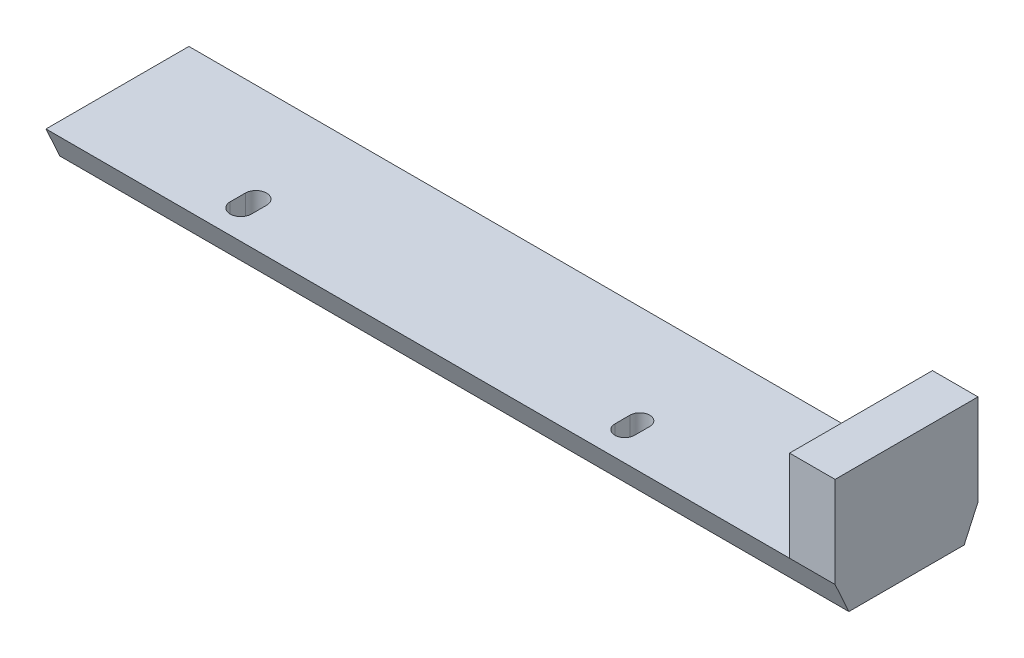
ISO-10303-21;
HEADER;
FILE_DESCRIPTION(('STEP AP214'),'2;1');
FILE_NAME('part.step','',(''),(''),'','','');
FILE_SCHEMA(('AUTOMOTIVE_DESIGN { 1 0 10303 214 1 1 1 1 }'));
ENDSEC;
DATA;
#1=APPLICATION_CONTEXT('core data for automotive mechanical design processes');
#2=APPLICATION_PROTOCOL_DEFINITION('international standard','automotive_design',2000,#1);
#3=PRODUCT_CONTEXT('',#1,'mechanical');
#4=PRODUCT('Part','Part','',(#3));
#5=PRODUCT_RELATED_PRODUCT_CATEGORY('part','',(#4));
#6=PRODUCT_DEFINITION_FORMATION('','',#4);
#7=PRODUCT_DEFINITION_CONTEXT('part definition',#1,'design');
#8=PRODUCT_DEFINITION('design','',#6,#7);
#9=PRODUCT_DEFINITION_SHAPE('','',#8);
#10=(LENGTH_UNIT() NAMED_UNIT(*) SI_UNIT(.MILLI.,.METRE.));
#11=(NAMED_UNIT(*) PLANE_ANGLE_UNIT() SI_UNIT($,.RADIAN.));
#12=(NAMED_UNIT(*) SI_UNIT($,.STERADIAN.) SOLID_ANGLE_UNIT());
#13=UNCERTAINTY_MEASURE_WITH_UNIT(LENGTH_MEASURE(1.E-05),#10,'distance_accuracy_value','');
#14=(GEOMETRIC_REPRESENTATION_CONTEXT(3) GLOBAL_UNCERTAINTY_ASSIGNED_CONTEXT((#13)) GLOBAL_UNIT_ASSIGNED_CONTEXT((#10,
#11,#12)) REPRESENTATION_CONTEXT('',''));
#15=CARTESIAN_POINT('',(0.,0.,0.));
#16=DIRECTION('',(0.,0.,1.));
#17=DIRECTION('',(1.,0.,0.));
#18=AXIS2_PLACEMENT_3D('',#15,#16,#17);
#19=CARTESIAN_POINT('',(0.,2.,0.));
#20=DIRECTION('',(0.,-1.,0.));
#21=DIRECTION('',(0.,0.,1.));
#22=AXIS2_PLACEMENT_3D('',#19,#20,#21);
#23=PLANE('',#22);
#24=DIRECTION('',(0.,0.,-1.));
#25=VECTOR('',#24,1.);
#26=CARTESIAN_POINT('',(10.2263631920337,2.,-2.20000000000115));
#27=LINE('',#26,#25);
#28=CARTESIAN_POINT('',(10.2263631920337,2.,-2.20000000000115));
#29=VERTEX_POINT('',#28);
#30=CARTESIAN_POINT('',(10.2263631920337,2.,-3.20000000000115));
#31=VERTEX_POINT('',#30);
#32=EDGE_CURVE('E239',#29,#31,#27,.T.);
#33=ORIENTED_EDGE('',*,*,#32,.T.);
#34=CARTESIAN_POINT('',(10.9263631920337,2.,-3.20000000000115));
#35=DIRECTION('',(0.,-1.,0.));
#36=DIRECTION('',(0.,0.,-1.));
#37=AXIS2_PLACEMENT_3D('',#34,#35,#36);
#38=CIRCLE('',#37,0.699999999999999);
#39=CARTESIAN_POINT('',(11.6263631920337,2.,-3.20000000000115));
#40=VERTEX_POINT('',#39);
#41=EDGE_CURVE('E236',#31,#40,#38,.T.);
#42=ORIENTED_EDGE('',*,*,#41,.T.);
#43=DIRECTION('',(0.,0.,1.));
#44=VECTOR('',#43,1.);
#45=CARTESIAN_POINT('',(11.6263631920337,2.,-2.20000000000115));
#46=LINE('',#45,#44);
#47=CARTESIAN_POINT('',(11.6263631920337,2.,-2.20000000000115));
#48=VERTEX_POINT('',#47);
#49=EDGE_CURVE('E232',#40,#48,#46,.T.);
#50=ORIENTED_EDGE('',*,*,#49,.T.);
#51=CARTESIAN_POINT('',(10.9263631920337,2.,-2.20000000000115));
#52=DIRECTION('',(0.,-1.,0.));
#53=DIRECTION('',(0.,0.,-1.));
#54=AXIS2_PLACEMENT_3D('',#51,#52,#53);
#55=CIRCLE('',#54,0.699999999999999);
#56=EDGE_CURVE('E206',#48,#29,#55,.T.);
#57=ORIENTED_EDGE('',*,*,#56,.T.);
#58=EDGE_LOOP('',(#33,#42,#50,#57));
#59=FACE_BOUND('',#58,.T.);
#60=DIRECTION('',(0.,0.,-1.));
#61=VECTOR('',#60,1.);
#62=CARTESIAN_POINT('',(35.5763631920337,2.,-2.20000000000115));
#63=LINE('',#62,#61);
#64=CARTESIAN_POINT('',(35.5763631920337,2.,-2.20000000000115));
#65=VERTEX_POINT('',#64);
#66=CARTESIAN_POINT('',(35.5763631920337,2.,-3.20000000000115));
#67=VERTEX_POINT('',#66);
#68=EDGE_CURVE('E207',#65,#67,#63,.T.);
#69=ORIENTED_EDGE('',*,*,#68,.T.);
#70=CARTESIAN_POINT('',(36.2263631920337,2.,-3.20000000000115));
#71=DIRECTION('',(0.,-1.,0.));
#72=DIRECTION('',(0.,0.,-1.));
#73=AXIS2_PLACEMENT_3D('',#70,#71,#72);
#74=CIRCLE('',#73,0.650000000000005);
#75=CARTESIAN_POINT('',(36.8763631920338,2.,-3.20000000000115));
#76=VERTEX_POINT('',#75);
#77=EDGE_CURVE('E210',#67,#76,#74,.T.);
#78=ORIENTED_EDGE('',*,*,#77,.T.);
#79=DIRECTION('',(0.,0.,1.));
#80=VECTOR('',#79,1.);
#81=CARTESIAN_POINT('',(36.8763631920338,2.,-2.20000000000115));
#82=LINE('',#81,#80);
#83=CARTESIAN_POINT('',(36.8763631920338,2.,-2.20000000000115));
#84=VERTEX_POINT('',#83);
#85=EDGE_CURVE('E192',#76,#84,#82,.T.);
#86=ORIENTED_EDGE('',*,*,#85,.T.);
#87=CARTESIAN_POINT('',(36.2263631920337,2.,-2.20000000000115));
#88=DIRECTION('',(0.,-1.,0.));
#89=DIRECTION('',(0.,0.,-1.));
#90=AXIS2_PLACEMENT_3D('',#87,#88,#89);
#91=CIRCLE('',#90,0.650000000000005);
#92=EDGE_CURVE('E203',#84,#65,#91,.T.);
#93=ORIENTED_EDGE('',*,*,#92,.T.);
#94=EDGE_LOOP('',(#69,#78,#86,#93));
#95=FACE_BOUND('',#94,.T.);
#96=DIRECTION('',(0.,0.,-1.));
#97=VECTOR('',#96,1.);
#98=CARTESIAN_POINT('',(49.,2.,0.));
#99=LINE('',#98,#97);
#100=CARTESIAN_POINT('',(49.,2.,-0.290909090909087));
#101=VERTEX_POINT('',#100);
#102=CARTESIAN_POINT('',(49.,2.,-9.70909090909091));
#103=VERTEX_POINT('',#102);
#104=EDGE_CURVE('E174',#101,#103,#99,.T.);
#105=ORIENTED_EDGE('',*,*,#104,.T.);
#106=DIRECTION('',(1.,0.,0.));
#107=VECTOR('',#106,1.);
#108=CARTESIAN_POINT('',(0.,2.,-9.70909090909091));
#109=LINE('',#108,#107);
#110=CARTESIAN_POINT('',(0.,2.,-9.70909090909091));
#111=VERTEX_POINT('',#110);
#112=EDGE_CURVE('E168',#111,#103,#109,.T.);
#113=ORIENTED_EDGE('',*,*,#112,.F.);
#114=DIRECTION('',(0.,0.,-1.));
#115=VECTOR('',#114,1.);
#116=CARTESIAN_POINT('',(0.,2.,-10.));
#117=LINE('',#116,#115);
#118=CARTESIAN_POINT('',(0.,2.,-0.290909090909087));
#119=VERTEX_POINT('',#118);
#120=EDGE_CURVE('E150',#119,#111,#117,.T.);
#121=ORIENTED_EDGE('',*,*,#120,.F.);
#122=DIRECTION('',(1.,0.,0.));
#123=VECTOR('',#122,1.);
#124=CARTESIAN_POINT('',(0.,2.,-0.290909090909087));
#125=LINE('',#124,#123);
#126=EDGE_CURVE('E159',#119,#101,#125,.T.);
#127=ORIENTED_EDGE('',*,*,#126,.T.);
#128=EDGE_LOOP('',(#105,#113,#121,#127));
#129=FACE_BOUND('',#128,.T.);
#130=ADVANCED_FACE('F38',(#59,#95,#129),#23,.F.);
#131=CARTESIAN_POINT('',(52.,2.,-10.));
#132=DIRECTION('',(-1.,0.,0.));
#133=DIRECTION('',(0.,0.,-1.));
#134=AXIS2_PLACEMENT_3D('',#131,#132,#133);
#135=PLANE('',#134);
#136=DIRECTION('',(0.,-0.910366477462604,-0.413802944301185));
#137=VECTOR('',#136,1.);
#138=CARTESIAN_POINT('',(52.,2.,-0.290909090909087));
#139=LINE('',#138,#137);
#140=CARTESIAN_POINT('',(52.,2.,-0.290909090909087));
#141=VERTEX_POINT('',#140);
#142=CARTESIAN_POINT('',(52.,0.,-1.2));
#143=VERTEX_POINT('',#142);
#144=EDGE_CURVE('E156',#141,#143,#139,.T.);
#145=ORIENTED_EDGE('',*,*,#144,.T.);
#146=DIRECTION('',(0.,0.,1.));
#147=VECTOR('',#146,1.);
#148=CARTESIAN_POINT('',(52.,0.,-10.));
#149=LINE('',#148,#147);
#150=CARTESIAN_POINT('',(52.,0.,-8.8));
#151=VERTEX_POINT('',#150);
#152=EDGE_CURVE('E170',#151,#143,#149,.T.);
#153=ORIENTED_EDGE('',*,*,#152,.F.);
#154=DIRECTION('',(0.,0.910366477462604,-0.413802944301186));
#155=VECTOR('',#154,1.);
#156=CARTESIAN_POINT('',(52.,2.,-9.70909090909091));
#157=LINE('',#156,#155);
#158=CARTESIAN_POINT('',(52.,2.,-9.70909090909091));
#159=VERTEX_POINT('',#158);
#160=EDGE_CURVE('E259',#151,#159,#157,.T.);
#161=ORIENTED_EDGE('',*,*,#160,.T.);
#162=DIRECTION('',(0.,1.,0.));
#163=VECTOR('',#162,1.);
#164=CARTESIAN_POINT('',(52.,8.,-9.70909090909091));
#165=LINE('',#164,#163);
#166=CARTESIAN_POINT('',(52.,8.,-9.70909090909091));
#167=VERTEX_POINT('',#166);
#168=EDGE_CURVE('E261',#159,#167,#165,.T.);
#169=ORIENTED_EDGE('',*,*,#168,.T.);
#170=DIRECTION('',(0.,0.,1.));
#171=VECTOR('',#170,1.);
#172=CARTESIAN_POINT('',(52.,8.,0.));
#173=LINE('',#172,#171);
#174=CARTESIAN_POINT('',(52.,8.,-0.290909090909087));
#175=VERTEX_POINT('',#174);
#176=EDGE_CURVE('E182',#167,#175,#173,.T.);
#177=ORIENTED_EDGE('',*,*,#176,.T.);
#178=DIRECTION('',(0.,-1.,0.));
#179=VECTOR('',#178,1.);
#180=CARTESIAN_POINT('',(52.,2.,-0.290909090909087));
#181=LINE('',#180,#179);
#182=EDGE_CURVE('E264',#175,#141,#181,.T.);
#183=ORIENTED_EDGE('',*,*,#182,.T.);
#184=EDGE_LOOP('',(#145,#153,#161,#169,#177,#183));
#185=FACE_BOUND('',#184,.T.);
#186=ADVANCED_FACE('F40',(#185),#135,.F.);
#187=CARTESIAN_POINT('',(0.,2.,-10.));
#188=DIRECTION('',(1.,0.,0.));
#189=DIRECTION('',(0.,0.,1.));
#190=AXIS2_PLACEMENT_3D('',#187,#188,#189);
#191=PLANE('',#190);
#192=ORIENTED_EDGE('',*,*,#120,.T.);
#193=DIRECTION('',(0.,0.910366477462604,-0.413802944301186));
#194=VECTOR('',#193,1.);
#195=CARTESIAN_POINT('',(0.,2.,-9.70909090909091));
#196=LINE('',#195,#194);
#197=CARTESIAN_POINT('',(0.,0.,-8.8));
#198=VERTEX_POINT('',#197);
#199=EDGE_CURVE('E257',#198,#111,#196,.T.);
#200=ORIENTED_EDGE('',*,*,#199,.F.);
#201=DIRECTION('',(0.,0.,-1.));
#202=VECTOR('',#201,1.);
#203=CARTESIAN_POINT('',(0.,0.,-10.));
#204=LINE('',#203,#202);
#205=CARTESIAN_POINT('',(0.,0.,-1.2));
#206=VERTEX_POINT('',#205);
#207=EDGE_CURVE('E153',#206,#198,#204,.T.);
#208=ORIENTED_EDGE('',*,*,#207,.F.);
#209=DIRECTION('',(0.,-0.910366477462604,-0.413802944301185));
#210=VECTOR('',#209,1.);
#211=CARTESIAN_POINT('',(0.,2.,-0.290909090909087));
#212=LINE('',#211,#210);
#213=EDGE_CURVE('E145',#119,#206,#212,.T.);
#214=ORIENTED_EDGE('',*,*,#213,.F.);
#215=EDGE_LOOP('',(#192,#200,#208,#214));
#216=FACE_BOUND('',#215,.T.);
#217=ADVANCED_FACE('F147',(#216),#191,.F.);
#218=CARTESIAN_POINT('',(0.,0.,0.));
#219=DIRECTION('',(0.,-1.,0.));
#220=DIRECTION('',(0.,0.,1.));
#221=AXIS2_PLACEMENT_3D('',#218,#219,#220);
#222=PLANE('',#221);
#223=DIRECTION('',(1.,0.,0.));
#224=VECTOR('',#223,1.);
#225=CARTESIAN_POINT('',(0.,0.,-1.2));
#226=LINE('',#225,#224);
#227=EDGE_CURVE('E165',#206,#143,#226,.T.);
#228=ORIENTED_EDGE('',*,*,#227,.F.);
#229=ORIENTED_EDGE('',*,*,#207,.T.);
#230=DIRECTION('',(1.,0.,0.));
#231=VECTOR('',#230,1.);
#232=CARTESIAN_POINT('',(0.,0.,-8.8));
#233=LINE('',#232,#231);
#234=EDGE_CURVE('E260',#198,#151,#233,.T.);
#235=ORIENTED_EDGE('',*,*,#234,.T.);
#236=ORIENTED_EDGE('',*,*,#152,.T.);
#237=EDGE_LOOP('',(#228,#229,#235,#236));
#238=FACE_BOUND('',#237,.T.);
#239=CARTESIAN_POINT('',(10.9263631920337,0.,-2.20000000000115));
#240=DIRECTION('',(0.,-1.,0.));
#241=DIRECTION('',(0.,0.,-1.));
#242=AXIS2_PLACEMENT_3D('',#239,#240,#241);
#243=CIRCLE('',#242,0.699999999999999);
#244=CARTESIAN_POINT('',(11.6263631920337,0.,-2.20000000000115));
#245=VERTEX_POINT('',#244);
#246=CARTESIAN_POINT('',(10.2263631920337,0.,-2.20000000000115));
#247=VERTEX_POINT('',#246);
#248=EDGE_CURVE('E235',#245,#247,#243,.T.);
#249=ORIENTED_EDGE('',*,*,#248,.F.);
#250=DIRECTION('',(0.,0.,1.));
#251=VECTOR('',#250,1.);
#252=CARTESIAN_POINT('',(11.6263631920337,0.,-2.20000000000115));
#253=LINE('',#252,#251);
#254=CARTESIAN_POINT('',(11.6263631920337,0.,-3.20000000000115));
#255=VERTEX_POINT('',#254);
#256=EDGE_CURVE('E226',#255,#245,#253,.T.);
#257=ORIENTED_EDGE('',*,*,#256,.F.);
#258=CARTESIAN_POINT('',(10.9263631920337,0.,-3.20000000000115));
#259=DIRECTION('',(0.,-1.,0.));
#260=DIRECTION('',(0.,0.,-1.));
#261=AXIS2_PLACEMENT_3D('',#258,#259,#260);
#262=CIRCLE('',#261,0.699999999999999);
#263=CARTESIAN_POINT('',(10.2263631920337,0.,-3.20000000000115));
#264=VERTEX_POINT('',#263);
#265=EDGE_CURVE('E246',#264,#255,#262,.T.);
#266=ORIENTED_EDGE('',*,*,#265,.F.);
#267=DIRECTION('',(0.,0.,-1.));
#268=VECTOR('',#267,1.);
#269=CARTESIAN_POINT('',(10.2263631920337,0.,-2.20000000000115));
#270=LINE('',#269,#268);
#271=EDGE_CURVE('E249',#247,#264,#270,.T.);
#272=ORIENTED_EDGE('',*,*,#271,.F.);
#273=EDGE_LOOP('',(#249,#257,#266,#272));
#274=FACE_BOUND('',#273,.T.);
#275=CARTESIAN_POINT('',(36.2263631920337,0.,-2.20000000000115));
#276=DIRECTION('',(0.,-1.,0.));
#277=DIRECTION('',(0.,0.,-1.));
#278=AXIS2_PLACEMENT_3D('',#275,#276,#277);
#279=CIRCLE('',#278,0.650000000000005);
#280=CARTESIAN_POINT('',(36.8763631920338,0.,-2.20000000000115));
#281=VERTEX_POINT('',#280);
#282=CARTESIAN_POINT('',(35.5763631920337,0.,-2.20000000000115));
#283=VERTEX_POINT('',#282);
#284=EDGE_CURVE('E189',#281,#283,#279,.T.);
#285=ORIENTED_EDGE('',*,*,#284,.F.);
#286=DIRECTION('',(0.,0.,1.));
#287=VECTOR('',#286,1.);
#288=CARTESIAN_POINT('',(36.8763631920338,0.,-2.20000000000115));
#289=LINE('',#288,#287);
#290=CARTESIAN_POINT('',(36.8763631920338,0.,-3.20000000000115));
#291=VERTEX_POINT('',#290);
#292=EDGE_CURVE('E199',#291,#281,#289,.T.);
#293=ORIENTED_EDGE('',*,*,#292,.F.);
#294=CARTESIAN_POINT('',(36.2263631920337,0.,-3.20000000000115));
#295=DIRECTION('',(0.,-1.,0.));
#296=DIRECTION('',(0.,0.,-1.));
#297=AXIS2_PLACEMENT_3D('',#294,#295,#296);
#298=CIRCLE('',#297,0.650000000000005);
#299=CARTESIAN_POINT('',(35.5763631920337,0.,-3.20000000000115));
#300=VERTEX_POINT('',#299);
#301=EDGE_CURVE('E196',#300,#291,#298,.T.);
#302=ORIENTED_EDGE('',*,*,#301,.F.);
#303=DIRECTION('',(0.,0.,-1.));
#304=VECTOR('',#303,1.);
#305=CARTESIAN_POINT('',(35.5763631920337,0.,-2.20000000000115));
#306=LINE('',#305,#304);
#307=EDGE_CURVE('E193',#283,#300,#306,.T.);
#308=ORIENTED_EDGE('',*,*,#307,.F.);
#309=EDGE_LOOP('',(#285,#293,#302,#308));
#310=FACE_BOUND('',#309,.T.);
#311=ADVANCED_FACE('F274',(#238,#274,#310),#222,.T.);
#312=CARTESIAN_POINT('',(49.,8.,0.));
#313=DIRECTION('',(1.,0.,0.));
#314=DIRECTION('',(0.,0.,1.));
#315=AXIS2_PLACEMENT_3D('',#312,#313,#314);
#316=PLANE('',#315);
#317=DIRECTION('',(0.,0.,-1.));
#318=VECTOR('',#317,1.);
#319=CARTESIAN_POINT('',(49.,8.,0.));
#320=LINE('',#319,#318);
#321=CARTESIAN_POINT('',(49.,8.,-0.290909090909087));
#322=VERTEX_POINT('',#321);
#323=CARTESIAN_POINT('',(49.,8.,-9.70909090909091));
#324=VERTEX_POINT('',#323);
#325=EDGE_CURVE('E177',#322,#324,#320,.T.);
#326=ORIENTED_EDGE('',*,*,#325,.T.);
#327=DIRECTION('',(0.,1.,0.));
#328=VECTOR('',#327,1.);
#329=CARTESIAN_POINT('',(49.,8.,-9.70909090909091));
#330=LINE('',#329,#328);
#331=EDGE_CURVE('E255',#103,#324,#330,.T.);
#332=ORIENTED_EDGE('',*,*,#331,.F.);
#333=ORIENTED_EDGE('',*,*,#104,.F.);
#334=DIRECTION('',(0.,-1.,0.));
#335=VECTOR('',#334,1.);
#336=CARTESIAN_POINT('',(49.,8.,-0.290909090909087));
#337=LINE('',#336,#335);
#338=EDGE_CURVE('E218',#322,#101,#337,.T.);
#339=ORIENTED_EDGE('',*,*,#338,.F.);
#340=EDGE_LOOP('',(#326,#332,#333,#339));
#341=FACE_BOUND('',#340,.T.);
#342=ADVANCED_FACE('F280',(#341),#316,.F.);
#343=CARTESIAN_POINT('',(0.,8.,0.));
#344=DIRECTION('',(0.,-1.,0.));
#345=DIRECTION('',(0.,0.,1.));
#346=AXIS2_PLACEMENT_3D('',#343,#344,#345);
#347=PLANE('',#346);
#348=ORIENTED_EDGE('',*,*,#176,.F.);
#349=DIRECTION('',(1.,0.,0.));
#350=VECTOR('',#349,1.);
#351=CARTESIAN_POINT('',(0.,8.,-9.70909090909091));
#352=LINE('',#351,#350);
#353=EDGE_CURVE('E46',#324,#167,#352,.T.);
#354=ORIENTED_EDGE('',*,*,#353,.F.);
#355=ORIENTED_EDGE('',*,*,#325,.F.);
#356=DIRECTION('',(-1.,0.,0.));
#357=VECTOR('',#356,1.);
#358=CARTESIAN_POINT('',(0.,8.,-0.290909090909087));
#359=LINE('',#358,#357);
#360=EDGE_CURVE('E11',#175,#322,#359,.T.);
#361=ORIENTED_EDGE('',*,*,#360,.F.);
#362=EDGE_LOOP('',(#348,#354,#355,#361));
#363=FACE_BOUND('',#362,.T.);
#364=ADVANCED_FACE('F282',(#363),#347,.F.);
#365=CARTESIAN_POINT('',(36.2263631920337,0.,-2.20000000000115));
#366=DIRECTION('',(0.,1.,0.));
#367=DIRECTION('',(0.,0.,-1.));
#368=AXIS2_PLACEMENT_3D('',#365,#366,#367);
#369=CYLINDRICAL_SURFACE('',#368,0.650000000000005);
#370=ORIENTED_EDGE('',*,*,#92,.F.);
#371=DIRECTION('',(0.,1.,0.));
#372=VECTOR('',#371,1.);
#373=CARTESIAN_POINT('',(36.8763631920338,0.,-2.20000000000115));
#374=LINE('',#373,#372);
#375=EDGE_CURVE('E215',#281,#84,#374,.T.);
#376=ORIENTED_EDGE('',*,*,#375,.F.);
#377=ORIENTED_EDGE('',*,*,#284,.T.);
#378=DIRECTION('',(0.,1.,0.));
#379=VECTOR('',#378,1.);
#380=CARTESIAN_POINT('',(35.5763631920337,0.,-2.20000000000115));
#381=LINE('',#380,#379);
#382=EDGE_CURVE('E202',#283,#65,#381,.T.);
#383=ORIENTED_EDGE('',*,*,#382,.T.);
#384=EDGE_LOOP('',(#370,#376,#377,#383));
#385=FACE_BOUND('',#384,.T.);
#386=ADVANCED_FACE('F284',(#385),#369,.F.);
#387=CARTESIAN_POINT('',(36.8763631920338,0.,-2.20000000000115));
#388=DIRECTION('',(1.,0.,0.));
#389=DIRECTION('',(0.,0.,1.));
#390=AXIS2_PLACEMENT_3D('',#387,#388,#389);
#391=PLANE('',#390);
#392=ORIENTED_EDGE('',*,*,#85,.F.);
#393=DIRECTION('',(0.,1.,0.));
#394=VECTOR('',#393,1.);
#395=CARTESIAN_POINT('',(36.8763631920338,0.,-3.20000000000115));
#396=LINE('',#395,#394);
#397=EDGE_CURVE('E217',#291,#76,#396,.T.);
#398=ORIENTED_EDGE('',*,*,#397,.F.);
#399=ORIENTED_EDGE('',*,*,#292,.T.);
#400=ORIENTED_EDGE('',*,*,#375,.T.);
#401=EDGE_LOOP('',(#392,#398,#399,#400));
#402=FACE_BOUND('',#401,.T.);
#403=ADVANCED_FACE('F290',(#402),#391,.F.);
#404=CARTESIAN_POINT('',(36.2263631920337,0.,-3.20000000000115));
#405=DIRECTION('',(0.,1.,0.));
#406=DIRECTION('',(0.,0.,-1.));
#407=AXIS2_PLACEMENT_3D('',#404,#405,#406);
#408=CYLINDRICAL_SURFACE('',#407,0.650000000000005);
#409=ORIENTED_EDGE('',*,*,#77,.F.);
#410=DIRECTION('',(0.,1.,0.));
#411=VECTOR('',#410,1.);
#412=CARTESIAN_POINT('',(35.5763631920337,0.,-3.20000000000115));
#413=LINE('',#412,#411);
#414=EDGE_CURVE('E220',#300,#67,#413,.T.);
#415=ORIENTED_EDGE('',*,*,#414,.F.);
#416=ORIENTED_EDGE('',*,*,#301,.T.);
#417=ORIENTED_EDGE('',*,*,#397,.T.);
#418=EDGE_LOOP('',(#409,#415,#416,#417));
#419=FACE_BOUND('',#418,.T.);
#420=ADVANCED_FACE('F342',(#419),#408,.F.);
#421=CARTESIAN_POINT('',(35.5763631920337,0.,-2.20000000000115));
#422=DIRECTION('',(-1.,0.,0.));
#423=DIRECTION('',(0.,0.,-1.));
#424=AXIS2_PLACEMENT_3D('',#421,#422,#423);
#425=PLANE('',#424);
#426=ORIENTED_EDGE('',*,*,#68,.F.);
#427=ORIENTED_EDGE('',*,*,#382,.F.);
#428=ORIENTED_EDGE('',*,*,#307,.T.);
#429=ORIENTED_EDGE('',*,*,#414,.T.);
#430=EDGE_LOOP('',(#426,#427,#428,#429));
#431=FACE_BOUND('',#430,.T.);
#432=ADVANCED_FACE('F352',(#431),#425,.F.);
#433=CARTESIAN_POINT('',(10.9263631920337,0.,-2.20000000000115));
#434=DIRECTION('',(0.,1.,0.));
#435=DIRECTION('',(0.,0.,-1.));
#436=AXIS2_PLACEMENT_3D('',#433,#434,#435);
#437=CYLINDRICAL_SURFACE('',#436,0.699999999999999);
#438=ORIENTED_EDGE('',*,*,#56,.F.);
#439=DIRECTION('',(0.,1.,0.));
#440=VECTOR('',#439,1.);
#441=CARTESIAN_POINT('',(11.6263631920337,0.,-2.20000000000115));
#442=LINE('',#441,#440);
#443=EDGE_CURVE('E230',#245,#48,#442,.T.);
#444=ORIENTED_EDGE('',*,*,#443,.F.);
#445=ORIENTED_EDGE('',*,*,#248,.T.);
#446=DIRECTION('',(0.,1.,0.));
#447=VECTOR('',#446,1.);
#448=CARTESIAN_POINT('',(10.2263631920337,0.,-2.20000000000115));
#449=LINE('',#448,#447);
#450=EDGE_CURVE('E223',#247,#29,#449,.T.);
#451=ORIENTED_EDGE('',*,*,#450,.T.);
#452=EDGE_LOOP('',(#438,#444,#445,#451));
#453=FACE_BOUND('',#452,.T.);
#454=ADVANCED_FACE('F363',(#453),#437,.F.);
#455=CARTESIAN_POINT('',(11.6263631920337,0.,-2.20000000000115));
#456=DIRECTION('',(1.,0.,0.));
#457=DIRECTION('',(0.,0.,1.));
#458=AXIS2_PLACEMENT_3D('',#455,#456,#457);
#459=PLANE('',#458);
#460=ORIENTED_EDGE('',*,*,#49,.F.);
#461=DIRECTION('',(0.,1.,0.));
#462=VECTOR('',#461,1.);
#463=CARTESIAN_POINT('',(11.6263631920337,0.,-3.20000000000115));
#464=LINE('',#463,#462);
#465=EDGE_CURVE('E228',#255,#40,#464,.T.);
#466=ORIENTED_EDGE('',*,*,#465,.F.);
#467=ORIENTED_EDGE('',*,*,#256,.T.);
#468=ORIENTED_EDGE('',*,*,#443,.T.);
#469=EDGE_LOOP('',(#460,#466,#467,#468));
#470=FACE_BOUND('',#469,.T.);
#471=ADVANCED_FACE('F374',(#470),#459,.F.);
#472=CARTESIAN_POINT('',(10.9263631920337,0.,-3.20000000000115));
#473=DIRECTION('',(0.,1.,0.));
#474=DIRECTION('',(0.,0.,-1.));
#475=AXIS2_PLACEMENT_3D('',#472,#473,#474);
#476=CYLINDRICAL_SURFACE('',#475,0.699999999999999);
#477=ORIENTED_EDGE('',*,*,#41,.F.);
#478=DIRECTION('',(0.,1.,0.));
#479=VECTOR('',#478,1.);
#480=CARTESIAN_POINT('',(10.2263631920337,0.,-3.20000000000115));
#481=LINE('',#480,#479);
#482=EDGE_CURVE('E225',#264,#31,#481,.T.);
#483=ORIENTED_EDGE('',*,*,#482,.F.);
#484=ORIENTED_EDGE('',*,*,#265,.T.);
#485=ORIENTED_EDGE('',*,*,#465,.T.);
#486=EDGE_LOOP('',(#477,#483,#484,#485));
#487=FACE_BOUND('',#486,.T.);
#488=ADVANCED_FACE('F385',(#487),#476,.F.);
#489=CARTESIAN_POINT('',(10.2263631920337,0.,-2.20000000000115));
#490=DIRECTION('',(-1.,0.,0.));
#491=DIRECTION('',(0.,0.,-1.));
#492=AXIS2_PLACEMENT_3D('',#489,#490,#491);
#493=PLANE('',#492);
#494=ORIENTED_EDGE('',*,*,#32,.F.);
#495=ORIENTED_EDGE('',*,*,#450,.F.);
#496=ORIENTED_EDGE('',*,*,#271,.T.);
#497=ORIENTED_EDGE('',*,*,#482,.T.);
#498=EDGE_LOOP('',(#494,#495,#496,#497));
#499=FACE_BOUND('',#498,.T.);
#500=ADVANCED_FACE('F396',(#499),#493,.F.);
#501=CARTESIAN_POINT('',(0.,8.,-9.70909090909091));
#502=DIRECTION('',(0.,0.,1.));
#503=DIRECTION('',(-1.,0.,0.));
#504=AXIS2_PLACEMENT_3D('',#501,#502,#503);
#505=PLANE('',#504);
#506=EDGE_CURVE('E268',#103,#159,#109,.T.);
#507=ORIENTED_EDGE('',*,*,#506,.F.);
#508=ORIENTED_EDGE('',*,*,#331,.T.);
#509=ORIENTED_EDGE('',*,*,#353,.T.);
#510=ORIENTED_EDGE('',*,*,#168,.F.);
#511=EDGE_LOOP('',(#507,#508,#509,#510));
#512=FACE_BOUND('',#511,.T.);
#513=ADVANCED_FACE('F279',(#512),#505,.F.);
#514=CARTESIAN_POINT('',(0.,2.,-9.70909090909091));
#515=DIRECTION('',(0.,0.413802944301185,0.910366477462604));
#516=DIRECTION('',(0.,0.910366477462604,-0.413802944301186));
#517=AXIS2_PLACEMENT_3D('',#514,#515,#516);
#518=PLANE('',#517);
#519=ORIENTED_EDGE('',*,*,#160,.F.);
#520=ORIENTED_EDGE('',*,*,#234,.F.);
#521=ORIENTED_EDGE('',*,*,#199,.T.);
#522=ORIENTED_EDGE('',*,*,#112,.T.);
#523=ORIENTED_EDGE('',*,*,#506,.T.);
#524=EDGE_LOOP('',(#519,#520,#521,#522,#523));
#525=FACE_BOUND('',#524,.T.);
#526=ADVANCED_FACE('F278',(#525),#518,.F.);
#527=CARTESIAN_POINT('',(0.,2.,-0.290909090909087));
#528=DIRECTION('',(0.,0.,-1.));
#529=DIRECTION('',(0.,-1.,0.));
#530=AXIS2_PLACEMENT_3D('',#527,#528,#529);
#531=PLANE('',#530);
#532=ORIENTED_EDGE('',*,*,#360,.T.);
#533=ORIENTED_EDGE('',*,*,#338,.T.);
#534=EDGE_CURVE('E155',#101,#141,#125,.T.);
#535=ORIENTED_EDGE('',*,*,#534,.T.);
#536=ORIENTED_EDGE('',*,*,#182,.F.);
#537=EDGE_LOOP('',(#532,#533,#535,#536));
#538=FACE_BOUND('',#537,.T.);
#539=ADVANCED_FACE('F426',(#538),#531,.F.);
#540=CARTESIAN_POINT('',(0.,2.,-0.290909090909087));
#541=DIRECTION('',(0.,0.413802944301185,-0.910366477462604));
#542=DIRECTION('',(0.,-0.910366477462604,-0.413802944301185));
#543=AXIS2_PLACEMENT_3D('',#540,#541,#542);
#544=PLANE('',#543);
#545=ORIENTED_EDGE('',*,*,#144,.F.);
#546=ORIENTED_EDGE('',*,*,#534,.F.);
#547=ORIENTED_EDGE('',*,*,#126,.F.);
#548=ORIENTED_EDGE('',*,*,#213,.T.);
#549=ORIENTED_EDGE('',*,*,#227,.T.);
#550=EDGE_LOOP('',(#545,#546,#547,#548,#549));
#551=FACE_BOUND('',#550,.T.);
#552=ADVANCED_FACE('F161',(#551),#544,.F.);
#553=CLOSED_SHELL('',(#130,#186,#217,#311,#342,#364,#386,#403,#420,#432,#454,#471,#488,#500,
#513,#526,#539,#552));
#554=MANIFOLD_SOLID_BREP('B2',#553);
#555=ADVANCED_BREP_SHAPE_REPRESENTATION('',(#18,#554),#14);
#556=SHAPE_DEFINITION_REPRESENTATION(#9,#555);
ENDSEC;
END-ISO-10303-21;
